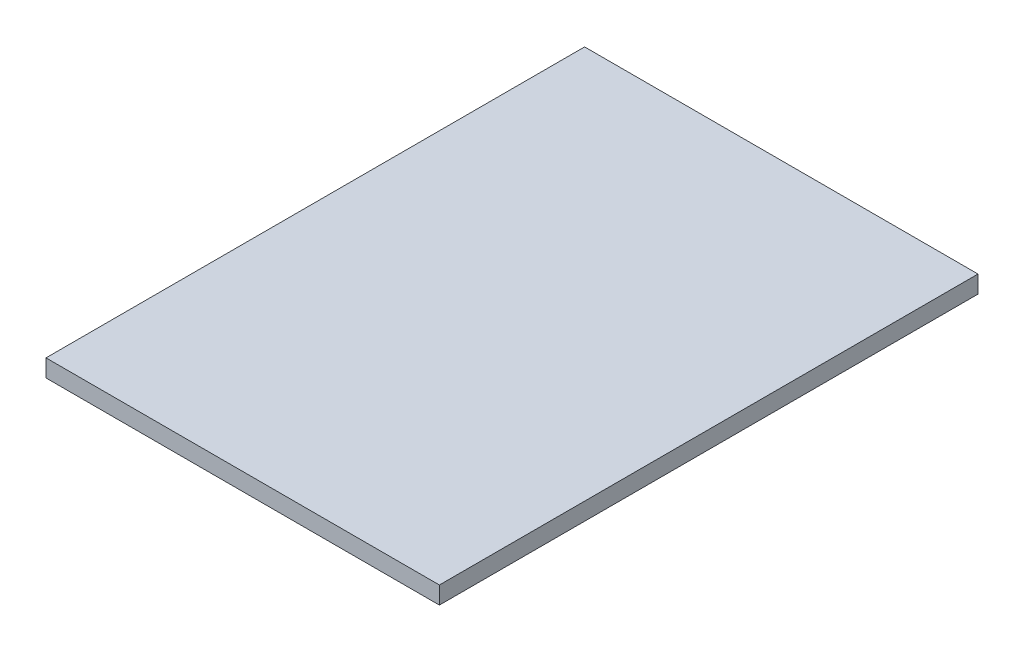
ISO-10303-21;
HEADER;
FILE_DESCRIPTION(('STEP AP214'),'2;1');
FILE_NAME('part.step','',(''),(''),'','','');
FILE_SCHEMA(('AUTOMOTIVE_DESIGN { 1 0 10303 214 1 1 1 1 }'));
ENDSEC;
DATA;
#1=APPLICATION_CONTEXT('core data for automotive mechanical design processes');
#2=APPLICATION_PROTOCOL_DEFINITION('international standard','automotive_design',2000,#1);
#3=PRODUCT_CONTEXT('',#1,'mechanical');
#4=PRODUCT('Part','Part','',(#3));
#5=PRODUCT_RELATED_PRODUCT_CATEGORY('part','',(#4));
#6=PRODUCT_DEFINITION_FORMATION('','',#4);
#7=PRODUCT_DEFINITION_CONTEXT('part definition',#1,'design');
#8=PRODUCT_DEFINITION('design','',#6,#7);
#9=PRODUCT_DEFINITION_SHAPE('','',#8);
#10=(LENGTH_UNIT() NAMED_UNIT(*) SI_UNIT(.MILLI.,.METRE.));
#11=(NAMED_UNIT(*) PLANE_ANGLE_UNIT() SI_UNIT($,.RADIAN.));
#12=(NAMED_UNIT(*) SI_UNIT($,.STERADIAN.) SOLID_ANGLE_UNIT());
#13=UNCERTAINTY_MEASURE_WITH_UNIT(LENGTH_MEASURE(1.E-05),#10,'distance_accuracy_value','');
#14=(GEOMETRIC_REPRESENTATION_CONTEXT(3) GLOBAL_UNCERTAINTY_ASSIGNED_CONTEXT((#13)) GLOBAL_UNIT_ASSIGNED_CONTEXT((#10,
#11,#12)) REPRESENTATION_CONTEXT('',''));
#15=CARTESIAN_POINT('',(0.,0.,0.));
#16=DIRECTION('',(0.,0.,1.));
#17=DIRECTION('',(1.,0.,0.));
#18=AXIS2_PLACEMENT_3D('',#15,#16,#17);
#19=CARTESIAN_POINT('',(0.,23.876,0.));
#20=DIRECTION('',(0.,-1.,0.));
#21=DIRECTION('',(0.,0.,-1.));
#22=AXIS2_PLACEMENT_3D('',#19,#20,#21);
#23=PLANE('',#22);
#24=DIRECTION('',(-1.,0.,0.));
#25=VECTOR('',#24,1.);
#26=CARTESIAN_POINT('',(673.354,23.876,-6.096));
#27=LINE('',#26,#25);
#28=CARTESIAN_POINT('',(673.354,23.876,-6.096));
#29=VERTEX_POINT('',#28);
#30=CARTESIAN_POINT('',(6.096,23.876,-6.096));
#31=VERTEX_POINT('',#30);
#32=EDGE_CURVE('E228',#29,#31,#27,.T.);
#33=ORIENTED_EDGE('',*,*,#32,.T.);
#34=DIRECTION('',(0.,0.,-1.));
#35=VECTOR('',#34,1.);
#36=CARTESIAN_POINT('',(6.096,23.876,-6.096));
#37=LINE('',#36,#35);
#38=CARTESIAN_POINT('',(6.096,23.876,-924.179));
#39=VERTEX_POINT('',#38);
#40=EDGE_CURVE('E231',#31,#39,#37,.T.);
#41=ORIENTED_EDGE('',*,*,#40,.T.);
#42=DIRECTION('',(1.,0.,0.));
#43=VECTOR('',#42,1.);
#44=CARTESIAN_POINT('',(6.096,23.876,-924.179));
#45=LINE('',#44,#43);
#46=CARTESIAN_POINT('',(673.354,23.876,-924.179));
#47=VERTEX_POINT('',#46);
#48=EDGE_CURVE('E234',#39,#47,#45,.T.);
#49=ORIENTED_EDGE('',*,*,#48,.T.);
#50=DIRECTION('',(0.,0.,1.));
#51=VECTOR('',#50,1.);
#52=CARTESIAN_POINT('',(673.354,23.876,-924.179));
#53=LINE('',#52,#51);
#54=EDGE_CURVE('E237',#47,#29,#53,.T.);
#55=ORIENTED_EDGE('',*,*,#54,.T.);
#56=EDGE_LOOP('',(#33,#41,#49,#55));
#57=FACE_BOUND('',#56,.T.);
#58=DIRECTION('',(-1.,0.,0.));
#59=VECTOR('',#58,1.);
#60=CARTESIAN_POINT('',(396.875,23.876,-790.575));
#61=LINE('',#60,#59);
#62=CARTESIAN_POINT('',(396.875,23.876,-790.575));
#63=VERTEX_POINT('',#62);
#64=CARTESIAN_POINT('',(282.575,23.876,-790.575));
#65=VERTEX_POINT('',#64);
#66=EDGE_CURVE('E593',#63,#65,#61,.T.);
#67=ORIENTED_EDGE('',*,*,#66,.F.);
#68=DIRECTION('',(0.,0.,1.));
#69=VECTOR('',#68,1.);
#70=CARTESIAN_POINT('',(396.875,23.876,-790.575));
#71=LINE('',#70,#69);
#72=CARTESIAN_POINT('',(396.875,23.876,-866.775));
#73=VERTEX_POINT('',#72);
#74=EDGE_CURVE('E183',#73,#63,#71,.T.);
#75=ORIENTED_EDGE('',*,*,#74,.F.);
#76=DIRECTION('',(1.,0.,0.));
#77=VECTOR('',#76,1.);
#78=CARTESIAN_POINT('',(396.875,23.876,-866.775));
#79=LINE('',#78,#77);
#80=CARTESIAN_POINT('',(282.575,23.876,-866.775));
#81=VERTEX_POINT('',#80);
#82=EDGE_CURVE('E179',#81,#73,#79,.T.);
#83=ORIENTED_EDGE('',*,*,#82,.F.);
#84=DIRECTION('',(0.,0.,-1.));
#85=VECTOR('',#84,1.);
#86=CARTESIAN_POINT('',(282.575,23.876,-790.575));
#87=LINE('',#86,#85);
#88=EDGE_CURVE('E590',#65,#81,#87,.T.);
#89=ORIENTED_EDGE('',*,*,#88,.F.);
#90=EDGE_LOOP('',(#67,#75,#83,#89));
#91=FACE_BOUND('',#90,.T.);
#92=ADVANCED_FACE('F46',(#57,#91),#23,.T.);
#93=CARTESIAN_POINT('',(0.,30.099,0.));
#94=DIRECTION('',(1.,0.,0.));
#95=DIRECTION('',(0.,0.,-1.));
#96=AXIS2_PLACEMENT_3D('',#93,#94,#95);
#97=PLANE('',#96);
#98=DIRECTION('',(0.,0.,1.));
#99=VECTOR('',#98,1.);
#100=CARTESIAN_POINT('',(0.,0.,0.));
#101=LINE('',#100,#99);
#102=CARTESIAN_POINT('',(0.,0.,-930.275));
#103=VERTEX_POINT('',#102);
#104=CARTESIAN_POINT('',(0.,0.,0.));
#105=VERTEX_POINT('',#104);
#106=EDGE_CURVE('E243',#103,#105,#101,.T.);
#107=ORIENTED_EDGE('',*,*,#106,.T.);
#108=DIRECTION('',(0.,-1.,0.));
#109=VECTOR('',#108,1.);
#110=CARTESIAN_POINT('',(0.,30.099,0.));
#111=LINE('',#110,#109);
#112=CARTESIAN_POINT('',(0.,30.099,0.));
#113=VERTEX_POINT('',#112);
#114=EDGE_CURVE('E54',#113,#105,#111,.T.);
#115=ORIENTED_EDGE('',*,*,#114,.F.);
#116=DIRECTION('',(0.,0.,1.));
#117=VECTOR('',#116,1.);
#118=CARTESIAN_POINT('',(0.,30.099,0.));
#119=LINE('',#118,#117);
#120=CARTESIAN_POINT('',(0.,30.099,-930.275));
#121=VERTEX_POINT('',#120);
#122=EDGE_CURVE('E250',#121,#113,#119,.T.);
#123=ORIENTED_EDGE('',*,*,#122,.F.);
#124=DIRECTION('',(0.,-1.,0.));
#125=VECTOR('',#124,1.);
#126=CARTESIAN_POINT('',(0.,30.099,-930.275));
#127=LINE('',#126,#125);
#128=EDGE_CURVE('E260',#121,#103,#127,.T.);
#129=ORIENTED_EDGE('',*,*,#128,.T.);
#130=EDGE_LOOP('',(#107,#115,#123,#129));
#131=FACE_BOUND('',#130,.T.);
#132=ADVANCED_FACE('F48',(#131),#97,.F.);
#133=CARTESIAN_POINT('',(0.,30.099,0.));
#134=DIRECTION('',(0.,0.,-1.));
#135=DIRECTION('',(-1.,0.,0.));
#136=AXIS2_PLACEMENT_3D('',#133,#134,#135);
#137=PLANE('',#136);
#138=DIRECTION('',(1.,0.,0.));
#139=VECTOR('',#138,1.);
#140=CARTESIAN_POINT('',(0.,0.,0.));
#141=LINE('',#140,#139);
#142=CARTESIAN_POINT('',(679.45,0.,0.));
#143=VERTEX_POINT('',#142);
#144=EDGE_CURVE('E263',#105,#143,#141,.T.);
#145=ORIENTED_EDGE('',*,*,#144,.T.);
#146=DIRECTION('',(0.,-1.,0.));
#147=VECTOR('',#146,1.);
#148=CARTESIAN_POINT('',(679.45,30.099,0.));
#149=LINE('',#148,#147);
#150=CARTESIAN_POINT('',(679.45,30.099,0.));
#151=VERTEX_POINT('',#150);
#152=EDGE_CURVE('E274',#151,#143,#149,.T.);
#153=ORIENTED_EDGE('',*,*,#152,.F.);
#154=DIRECTION('',(1.,0.,0.));
#155=VECTOR('',#154,1.);
#156=CARTESIAN_POINT('',(0.,30.099,0.));
#157=LINE('',#156,#155);
#158=EDGE_CURVE('E253',#113,#151,#157,.T.);
#159=ORIENTED_EDGE('',*,*,#158,.F.);
#160=ORIENTED_EDGE('',*,*,#114,.T.);
#161=EDGE_LOOP('',(#145,#153,#159,#160));
#162=FACE_BOUND('',#161,.T.);
#163=ADVANCED_FACE('F278',(#162),#137,.F.);
#164=CARTESIAN_POINT('',(679.45,30.099,0.));
#165=DIRECTION('',(-1.,0.,0.));
#166=DIRECTION('',(0.,0.,1.));
#167=AXIS2_PLACEMENT_3D('',#164,#165,#166);
#168=PLANE('',#167);
#169=DIRECTION('',(0.,0.,-1.));
#170=VECTOR('',#169,1.);
#171=CARTESIAN_POINT('',(679.45,0.,0.));
#172=LINE('',#171,#170);
#173=CARTESIAN_POINT('',(679.45,0.,-930.275));
#174=VERTEX_POINT('',#173);
#175=EDGE_CURVE('E266',#143,#174,#172,.T.);
#176=ORIENTED_EDGE('',*,*,#175,.T.);
#177=DIRECTION('',(0.,-1.,0.));
#178=VECTOR('',#177,1.);
#179=CARTESIAN_POINT('',(679.45,30.099,-930.275));
#180=LINE('',#179,#178);
#181=CARTESIAN_POINT('',(679.45,30.099,-930.275));
#182=VERTEX_POINT('',#181);
#183=EDGE_CURVE('E272',#182,#174,#180,.T.);
#184=ORIENTED_EDGE('',*,*,#183,.F.);
#185=DIRECTION('',(0.,0.,-1.));
#186=VECTOR('',#185,1.);
#187=CARTESIAN_POINT('',(679.45,30.099,0.));
#188=LINE('',#187,#186);
#189=EDGE_CURVE('E256',#151,#182,#188,.T.);
#190=ORIENTED_EDGE('',*,*,#189,.F.);
#191=ORIENTED_EDGE('',*,*,#152,.T.);
#192=EDGE_LOOP('',(#176,#184,#190,#191));
#193=FACE_BOUND('',#192,.T.);
#194=ADVANCED_FACE('F295',(#193),#168,.F.);
#195=CARTESIAN_POINT('',(0.,30.099,-930.275));
#196=DIRECTION('',(0.,0.,1.));
#197=DIRECTION('',(1.,0.,0.));
#198=AXIS2_PLACEMENT_3D('',#195,#196,#197);
#199=PLANE('',#198);
#200=DIRECTION('',(-1.,0.,0.));
#201=VECTOR('',#200,1.);
#202=CARTESIAN_POINT('',(0.,0.,-930.275));
#203=LINE('',#202,#201);
#204=EDGE_CURVE('E254',#174,#103,#203,.T.);
#205=ORIENTED_EDGE('',*,*,#204,.T.);
#206=ORIENTED_EDGE('',*,*,#128,.F.);
#207=DIRECTION('',(-1.,0.,0.));
#208=VECTOR('',#207,1.);
#209=CARTESIAN_POINT('',(0.,30.099,-930.275));
#210=LINE('',#209,#208);
#211=EDGE_CURVE('E258',#182,#121,#210,.T.);
#212=ORIENTED_EDGE('',*,*,#211,.F.);
#213=ORIENTED_EDGE('',*,*,#183,.T.);
#214=EDGE_LOOP('',(#205,#206,#212,#213));
#215=FACE_BOUND('',#214,.T.);
#216=ADVANCED_FACE('F291',(#215),#199,.F.);
#217=CARTESIAN_POINT('',(0.,30.099,0.));
#218=DIRECTION('',(0.,-1.,0.));
#219=DIRECTION('',(0.,0.,-1.));
#220=AXIS2_PLACEMENT_3D('',#217,#218,#219);
#221=PLANE('',#220);
#222=ORIENTED_EDGE('',*,*,#122,.T.);
#223=ORIENTED_EDGE('',*,*,#158,.T.);
#224=ORIENTED_EDGE('',*,*,#189,.T.);
#225=ORIENTED_EDGE('',*,*,#211,.T.);
#226=EDGE_LOOP('',(#222,#223,#224,#225));
#227=FACE_BOUND('',#226,.T.);
#228=ADVANCED_FACE('F297',(#227),#221,.F.);
#229=CARTESIAN_POINT('',(0.,0.,0.));
#230=DIRECTION('',(0.,-1.,0.));
#231=DIRECTION('',(0.,0.,-1.));
#232=AXIS2_PLACEMENT_3D('',#229,#230,#231);
#233=PLANE('',#232);
#234=ORIENTED_EDGE('',*,*,#106,.F.);
#235=ORIENTED_EDGE('',*,*,#204,.F.);
#236=ORIENTED_EDGE('',*,*,#175,.F.);
#237=ORIENTED_EDGE('',*,*,#144,.F.);
#238=EDGE_LOOP('',(#234,#235,#236,#237));
#239=FACE_BOUND('',#238,.T.);
#240=DIRECTION('',(0.,0.,1.));
#241=VECTOR('',#240,1.);
#242=CARTESIAN_POINT('',(654.558,0.,-24.892));
#243=LINE('',#242,#241);
#244=CARTESIAN_POINT('',(654.558,0.,-905.383));
#245=VERTEX_POINT('',#244);
#246=CARTESIAN_POINT('',(654.558,0.,-24.892));
#247=VERTEX_POINT('',#246);
#248=EDGE_CURVE('E185',#245,#247,#243,.T.);
#249=ORIENTED_EDGE('',*,*,#248,.F.);
#250=DIRECTION('',(1.,0.,0.));
#251=VECTOR('',#250,1.);
#252=CARTESIAN_POINT('',(654.558,0.,-905.383));
#253=LINE('',#252,#251);
#254=CARTESIAN_POINT('',(24.8920000000001,0.,-905.383));
#255=VERTEX_POINT('',#254);
#256=EDGE_CURVE('E196',#255,#245,#253,.T.);
#257=ORIENTED_EDGE('',*,*,#256,.F.);
#258=DIRECTION('',(0.,0.,-1.));
#259=VECTOR('',#258,1.);
#260=CARTESIAN_POINT('',(24.892,0.,-24.8920000000001));
#261=LINE('',#260,#259);
#262=CARTESIAN_POINT('',(24.892,0.,-24.8920000000001));
#263=VERTEX_POINT('',#262);
#264=EDGE_CURVE('E208',#263,#255,#261,.T.);
#265=ORIENTED_EDGE('',*,*,#264,.F.);
#266=DIRECTION('',(-1.,0.,0.));
#267=VECTOR('',#266,1.);
#268=CARTESIAN_POINT('',(654.558,0.,-24.892));
#269=LINE('',#268,#267);
#270=EDGE_CURVE('E187',#247,#263,#269,.T.);
#271=ORIENTED_EDGE('',*,*,#270,.F.);
#272=EDGE_LOOP('',(#249,#257,#265,#271));
#273=FACE_BOUND('',#272,.T.);
#274=ADVANCED_FACE('F285',(#239,#273),#233,.T.);
#275=CARTESIAN_POINT('',(0.,0.889,0.));
#276=DIRECTION('',(0.,-1.,0.));
#277=DIRECTION('',(0.,0.,-1.));
#278=AXIS2_PLACEMENT_3D('',#275,#276,#277);
#279=PLANE('',#278);
#280=DIRECTION('',(1.,0.,0.));
#281=VECTOR('',#280,1.);
#282=CARTESIAN_POINT('',(654.558,0.889,-905.383));
#283=LINE('',#282,#281);
#284=CARTESIAN_POINT('',(24.8920000000001,0.889,-905.383));
#285=VERTEX_POINT('',#284);
#286=CARTESIAN_POINT('',(654.558,0.889,-905.383));
#287=VERTEX_POINT('',#286);
#288=EDGE_CURVE('E202',#285,#287,#283,.T.);
#289=ORIENTED_EDGE('',*,*,#288,.T.);
#290=DIRECTION('',(0.,0.,1.));
#291=VECTOR('',#290,1.);
#292=CARTESIAN_POINT('',(654.558,0.889,-24.892));
#293=LINE('',#292,#291);
#294=CARTESIAN_POINT('',(654.558,0.889,-24.892));
#295=VERTEX_POINT('',#294);
#296=EDGE_CURVE('E192',#287,#295,#293,.T.);
#297=ORIENTED_EDGE('',*,*,#296,.T.);
#298=DIRECTION('',(-1.,0.,0.));
#299=VECTOR('',#298,1.);
#300=CARTESIAN_POINT('',(654.558,0.889,-24.892));
#301=LINE('',#300,#299);
#302=CARTESIAN_POINT('',(24.892,0.889,-24.8920000000001));
#303=VERTEX_POINT('',#302);
#304=EDGE_CURVE('E195',#295,#303,#301,.T.);
#305=ORIENTED_EDGE('',*,*,#304,.T.);
#306=DIRECTION('',(0.,0.,-1.));
#307=VECTOR('',#306,1.);
#308=CARTESIAN_POINT('',(24.892,0.889,-24.8920000000001));
#309=LINE('',#308,#307);
#310=EDGE_CURVE('E199',#303,#285,#309,.T.);
#311=ORIENTED_EDGE('',*,*,#310,.T.);
#312=EDGE_LOOP('',(#289,#297,#305,#311));
#313=FACE_BOUND('',#312,.T.);
#314=DIRECTION('',(0.,0.,1.));
#315=VECTOR('',#314,1.);
#316=CARTESIAN_POINT('',(6.096,0.889000000000001,-6.096));
#317=LINE('',#316,#315);
#318=CARTESIAN_POINT('',(6.096,0.889000000000001,-924.179));
#319=VERTEX_POINT('',#318);
#320=CARTESIAN_POINT('',(6.096,0.889000000000001,-6.096));
#321=VERTEX_POINT('',#320);
#322=EDGE_CURVE('E11',#319,#321,#317,.T.);
#323=ORIENTED_EDGE('',*,*,#322,.T.);
#324=DIRECTION('',(1.,0.,0.));
#325=VECTOR('',#324,1.);
#326=CARTESIAN_POINT('',(673.354,0.889000000000001,-6.096));
#327=LINE('',#326,#325);
#328=CARTESIAN_POINT('',(673.354,0.889000000000001,-6.096));
#329=VERTEX_POINT('',#328);
#330=EDGE_CURVE('E225',#321,#329,#327,.T.);
#331=ORIENTED_EDGE('',*,*,#330,.T.);
#332=DIRECTION('',(0.,0.,-1.));
#333=VECTOR('',#332,1.);
#334=CARTESIAN_POINT('',(673.354,0.889000000000001,-924.179));
#335=LINE('',#334,#333);
#336=CARTESIAN_POINT('',(673.354,0.889000000000001,-924.179));
#337=VERTEX_POINT('',#336);
#338=EDGE_CURVE('E69',#329,#337,#335,.T.);
#339=ORIENTED_EDGE('',*,*,#338,.T.);
#340=DIRECTION('',(-1.,0.,0.));
#341=VECTOR('',#340,1.);
#342=CARTESIAN_POINT('',(6.096,0.889000000000001,-924.179));
#343=LINE('',#342,#341);
#344=EDGE_CURVE('E215',#337,#319,#343,.T.);
#345=ORIENTED_EDGE('',*,*,#344,.T.);
#346=EDGE_LOOP('',(#323,#331,#339,#345));
#347=FACE_BOUND('',#346,.T.);
#348=ADVANCED_FACE('F304',(#313,#347),#279,.F.);
#349=CARTESIAN_POINT('',(654.558,0.889,-24.892));
#350=DIRECTION('',(1.,0.,0.));
#351=DIRECTION('',(0.,0.,-1.));
#352=AXIS2_PLACEMENT_3D('',#349,#350,#351);
#353=PLANE('',#352);
#354=ORIENTED_EDGE('',*,*,#248,.T.);
#355=DIRECTION('',(0.,-1.,0.));
#356=VECTOR('',#355,1.);
#357=CARTESIAN_POINT('',(654.558,0.889,-24.892));
#358=LINE('',#357,#356);
#359=EDGE_CURVE('E204',#295,#247,#358,.T.);
#360=ORIENTED_EDGE('',*,*,#359,.F.);
#361=ORIENTED_EDGE('',*,*,#296,.F.);
#362=DIRECTION('',(0.,-1.,0.));
#363=VECTOR('',#362,1.);
#364=CARTESIAN_POINT('',(654.558,0.889,-905.383));
#365=LINE('',#364,#363);
#366=EDGE_CURVE('E213',#287,#245,#365,.T.);
#367=ORIENTED_EDGE('',*,*,#366,.T.);
#368=EDGE_LOOP('',(#354,#360,#361,#367));
#369=FACE_BOUND('',#368,.T.);
#370=ADVANCED_FACE('F343',(#369),#353,.F.);
#371=CARTESIAN_POINT('',(654.558,0.889,-905.383));
#372=DIRECTION('',(0.,0.,-1.));
#373=DIRECTION('',(-1.,0.,0.));
#374=AXIS2_PLACEMENT_3D('',#371,#372,#373);
#375=PLANE('',#374);
#376=ORIENTED_EDGE('',*,*,#256,.T.);
#377=ORIENTED_EDGE('',*,*,#366,.F.);
#378=ORIENTED_EDGE('',*,*,#288,.F.);
#379=DIRECTION('',(0.,-1.,0.));
#380=VECTOR('',#379,1.);
#381=CARTESIAN_POINT('',(24.8920000000001,0.889,-905.383));
#382=LINE('',#381,#380);
#383=EDGE_CURVE('E216',#285,#255,#382,.T.);
#384=ORIENTED_EDGE('',*,*,#383,.T.);
#385=EDGE_LOOP('',(#376,#377,#378,#384));
#386=FACE_BOUND('',#385,.T.);
#387=ADVANCED_FACE('F348',(#386),#375,.F.);
#388=CARTESIAN_POINT('',(24.892,0.889,-24.8920000000001));
#389=DIRECTION('',(-1.,0.,0.));
#390=DIRECTION('',(0.,0.,1.));
#391=AXIS2_PLACEMENT_3D('',#388,#389,#390);
#392=PLANE('',#391);
#393=ORIENTED_EDGE('',*,*,#264,.T.);
#394=ORIENTED_EDGE('',*,*,#383,.F.);
#395=ORIENTED_EDGE('',*,*,#310,.F.);
#396=DIRECTION('',(0.,-1.,0.));
#397=VECTOR('',#396,1.);
#398=CARTESIAN_POINT('',(24.892,0.889,-24.8920000000001));
#399=LINE('',#398,#397);
#400=EDGE_CURVE('E218',#303,#263,#399,.T.);
#401=ORIENTED_EDGE('',*,*,#400,.T.);
#402=EDGE_LOOP('',(#393,#394,#395,#401));
#403=FACE_BOUND('',#402,.T.);
#404=ADVANCED_FACE('F361',(#403),#392,.F.);
#405=CARTESIAN_POINT('',(654.558,0.889,-24.892));
#406=DIRECTION('',(0.,0.,1.));
#407=DIRECTION('',(1.,0.,0.));
#408=AXIS2_PLACEMENT_3D('',#405,#406,#407);
#409=PLANE('',#408);
#410=ORIENTED_EDGE('',*,*,#270,.T.);
#411=ORIENTED_EDGE('',*,*,#400,.F.);
#412=ORIENTED_EDGE('',*,*,#304,.F.);
#413=ORIENTED_EDGE('',*,*,#359,.T.);
#414=EDGE_LOOP('',(#410,#411,#412,#413));
#415=FACE_BOUND('',#414,.T.);
#416=ADVANCED_FACE('F328',(#415),#409,.F.);
#417=CARTESIAN_POINT('',(6.096,23.876,-6.096));
#418=DIRECTION('',(-1.,0.,0.));
#419=DIRECTION('',(0.,0.,1.));
#420=AXIS2_PLACEMENT_3D('',#417,#418,#419);
#421=PLANE('',#420);
#422=ORIENTED_EDGE('',*,*,#322,.F.);
#423=DIRECTION('',(0.,-1.,0.));
#424=VECTOR('',#423,1.);
#425=CARTESIAN_POINT('',(6.096,23.876,-924.179));
#426=LINE('',#425,#424);
#427=EDGE_CURVE('E246',#39,#319,#426,.T.);
#428=ORIENTED_EDGE('',*,*,#427,.F.);
#429=ORIENTED_EDGE('',*,*,#40,.F.);
#430=DIRECTION('',(0.,-1.,0.));
#431=VECTOR('',#430,1.);
#432=CARTESIAN_POINT('',(6.096,23.876,-6.096));
#433=LINE('',#432,#431);
#434=EDGE_CURVE('E240',#31,#321,#433,.T.);
#435=ORIENTED_EDGE('',*,*,#434,.T.);
#436=EDGE_LOOP('',(#422,#428,#429,#435));
#437=FACE_BOUND('',#436,.T.);
#438=ADVANCED_FACE('F325',(#437),#421,.F.);
#439=CARTESIAN_POINT('',(6.096,23.876,-924.179));
#440=DIRECTION('',(0.,0.,-1.));
#441=DIRECTION('',(-1.,0.,0.));
#442=AXIS2_PLACEMENT_3D('',#439,#440,#441);
#443=PLANE('',#442);
#444=ORIENTED_EDGE('',*,*,#344,.F.);
#445=DIRECTION('',(0.,-1.,0.));
#446=VECTOR('',#445,1.);
#447=CARTESIAN_POINT('',(673.354,23.876,-924.179));
#448=LINE('',#447,#446);
#449=EDGE_CURVE('E244',#47,#337,#448,.T.);
#450=ORIENTED_EDGE('',*,*,#449,.F.);
#451=ORIENTED_EDGE('',*,*,#48,.F.);
#452=ORIENTED_EDGE('',*,*,#427,.T.);
#453=EDGE_LOOP('',(#444,#450,#451,#452));
#454=FACE_BOUND('',#453,.T.);
#455=ADVANCED_FACE('F322',(#454),#443,.F.);
#456=CARTESIAN_POINT('',(673.354,23.876,-924.179));
#457=DIRECTION('',(1.,0.,0.));
#458=DIRECTION('',(0.,0.,-1.));
#459=AXIS2_PLACEMENT_3D('',#456,#457,#458);
#460=PLANE('',#459);
#461=ORIENTED_EDGE('',*,*,#338,.F.);
#462=DIRECTION('',(0.,-1.,0.));
#463=VECTOR('',#462,1.);
#464=CARTESIAN_POINT('',(673.354,23.876,-6.096));
#465=LINE('',#464,#463);
#466=EDGE_CURVE('E241',#29,#329,#465,.T.);
#467=ORIENTED_EDGE('',*,*,#466,.F.);
#468=ORIENTED_EDGE('',*,*,#54,.F.);
#469=ORIENTED_EDGE('',*,*,#449,.T.);
#470=EDGE_LOOP('',(#461,#467,#468,#469));
#471=FACE_BOUND('',#470,.T.);
#472=ADVANCED_FACE('F318',(#471),#460,.F.);
#473=CARTESIAN_POINT('',(673.354,23.876,-6.096));
#474=DIRECTION('',(0.,0.,1.));
#475=DIRECTION('',(1.,0.,0.));
#476=AXIS2_PLACEMENT_3D('',#473,#474,#475);
#477=PLANE('',#476);
#478=ORIENTED_EDGE('',*,*,#330,.F.);
#479=ORIENTED_EDGE('',*,*,#434,.F.);
#480=ORIENTED_EDGE('',*,*,#32,.F.);
#481=ORIENTED_EDGE('',*,*,#466,.T.);
#482=EDGE_LOOP('',(#478,#479,#480,#481));
#483=FACE_BOUND('',#482,.T.);
#484=ADVANCED_FACE('F321',(#483),#477,.F.);
#485=CARTESIAN_POINT('',(396.875,11.176,-790.575));
#486=DIRECTION('',(-1.,0.,0.));
#487=DIRECTION('',(0.,0.,1.));
#488=AXIS2_PLACEMENT_3D('',#485,#486,#487);
#489=PLANE('',#488);
#490=ORIENTED_EDGE('',*,*,#74,.T.);
#491=DIRECTION('',(0.,1.,0.));
#492=VECTOR('',#491,1.);
#493=CARTESIAN_POINT('',(396.875,11.176,-790.575));
#494=LINE('',#493,#492);
#495=CARTESIAN_POINT('',(396.875,11.176,-790.575));
#496=VERTEX_POINT('',#495);
#497=EDGE_CURVE('E164',#496,#63,#494,.T.);
#498=ORIENTED_EDGE('',*,*,#497,.F.);
#499=DIRECTION('',(0.,0.,1.));
#500=VECTOR('',#499,1.);
#501=CARTESIAN_POINT('',(396.875,11.176,-790.575));
#502=LINE('',#501,#500);
#503=CARTESIAN_POINT('',(396.875,11.176,-866.775));
#504=VERTEX_POINT('',#503);
#505=EDGE_CURVE('E171',#504,#496,#502,.T.);
#506=ORIENTED_EDGE('',*,*,#505,.F.);
#507=DIRECTION('',(0.,1.,0.));
#508=VECTOR('',#507,1.);
#509=CARTESIAN_POINT('',(396.875,11.176,-866.775));
#510=LINE('',#509,#508);
#511=EDGE_CURVE('E588',#504,#73,#510,.T.);
#512=ORIENTED_EDGE('',*,*,#511,.T.);
#513=EDGE_LOOP('',(#490,#498,#506,#512));
#514=FACE_BOUND('',#513,.T.);
#515=ADVANCED_FACE('F181',(#514),#489,.F.);
#516=CARTESIAN_POINT('',(396.875,11.176,-790.575));
#517=DIRECTION('',(0.,0.,-1.));
#518=DIRECTION('',(-1.,0.,0.));
#519=AXIS2_PLACEMENT_3D('',#516,#517,#518);
#520=PLANE('',#519);
#521=ORIENTED_EDGE('',*,*,#66,.T.);
#522=DIRECTION('',(0.,1.,0.));
#523=VECTOR('',#522,1.);
#524=CARTESIAN_POINT('',(282.575,11.176,-790.575));
#525=LINE('',#524,#523);
#526=CARTESIAN_POINT('',(282.575,11.176,-790.575));
#527=VERTEX_POINT('',#526);
#528=EDGE_CURVE('E167',#527,#65,#525,.T.);
#529=ORIENTED_EDGE('',*,*,#528,.F.);
#530=DIRECTION('',(-1.,0.,0.));
#531=VECTOR('',#530,1.);
#532=CARTESIAN_POINT('',(396.875,11.176,-790.575));
#533=LINE('',#532,#531);
#534=EDGE_CURVE('E160',#496,#527,#533,.T.);
#535=ORIENTED_EDGE('',*,*,#534,.F.);
#536=ORIENTED_EDGE('',*,*,#497,.T.);
#537=EDGE_LOOP('',(#521,#529,#535,#536));
#538=FACE_BOUND('',#537,.T.);
#539=ADVANCED_FACE('F162',(#538),#520,.F.);
#540=CARTESIAN_POINT('',(282.575,11.176,-790.575));
#541=DIRECTION('',(1.,0.,0.));
#542=DIRECTION('',(0.,0.,-1.));
#543=AXIS2_PLACEMENT_3D('',#540,#541,#542);
#544=PLANE('',#543);
#545=ORIENTED_EDGE('',*,*,#88,.T.);
#546=DIRECTION('',(0.,1.,0.));
#547=VECTOR('',#546,1.);
#548=CARTESIAN_POINT('',(282.575,11.176,-866.775));
#549=LINE('',#548,#547);
#550=CARTESIAN_POINT('',(282.575,11.176,-866.775));
#551=VERTEX_POINT('',#550);
#552=EDGE_CURVE('E61',#551,#81,#549,.T.);
#553=ORIENTED_EDGE('',*,*,#552,.F.);
#554=DIRECTION('',(0.,0.,-1.));
#555=VECTOR('',#554,1.);
#556=CARTESIAN_POINT('',(282.575,11.176,-790.575));
#557=LINE('',#556,#555);
#558=EDGE_CURVE('E170',#527,#551,#557,.T.);
#559=ORIENTED_EDGE('',*,*,#558,.F.);
#560=ORIENTED_EDGE('',*,*,#528,.T.);
#561=EDGE_LOOP('',(#545,#553,#559,#560));
#562=FACE_BOUND('',#561,.T.);
#563=ADVANCED_FACE('F373',(#562),#544,.F.);
#564=CARTESIAN_POINT('',(396.875,11.176,-866.775));
#565=DIRECTION('',(0.,0.,1.));
#566=DIRECTION('',(1.,0.,0.));
#567=AXIS2_PLACEMENT_3D('',#564,#565,#566);
#568=PLANE('',#567);
#569=ORIENTED_EDGE('',*,*,#82,.T.);
#570=ORIENTED_EDGE('',*,*,#511,.F.);
#571=DIRECTION('',(1.,0.,0.));
#572=VECTOR('',#571,1.);
#573=CARTESIAN_POINT('',(396.875,11.176,-866.775));
#574=LINE('',#573,#572);
#575=EDGE_CURVE('E175',#551,#504,#574,.T.);
#576=ORIENTED_EDGE('',*,*,#575,.F.);
#577=ORIENTED_EDGE('',*,*,#552,.T.);
#578=EDGE_LOOP('',(#569,#570,#576,#577));
#579=FACE_BOUND('',#578,.T.);
#580=ADVANCED_FACE('F376',(#579),#568,.F.);
#581=CARTESIAN_POINT('',(0.,11.176,0.));
#582=DIRECTION('',(0.,1.,0.));
#583=DIRECTION('',(0.,0.,1.));
#584=AXIS2_PLACEMENT_3D('',#581,#582,#583);
#585=PLANE('',#584);
#586=ORIENTED_EDGE('',*,*,#505,.T.);
#587=ORIENTED_EDGE('',*,*,#534,.T.);
#588=ORIENTED_EDGE('',*,*,#558,.T.);
#589=ORIENTED_EDGE('',*,*,#575,.T.);
#590=EDGE_LOOP('',(#586,#587,#588,#589));
#591=FACE_BOUND('',#590,.T.);
#592=ADVANCED_FACE('F174',(#591),#585,.F.);
#593=CLOSED_SHELL('',(#92,#132,#163,#194,#216,#228,#274,#348,#370,#387,#404,#416,#438,#455,#472,
#484,#515,#539,#563,#580,#592));
#594=MANIFOLD_SOLID_BREP('B2',#593);
#595=ADVANCED_BREP_SHAPE_REPRESENTATION('',(#18,#594),#14);
#596=SHAPE_DEFINITION_REPRESENTATION(#9,#595);
ENDSEC;
END-ISO-10303-21;
